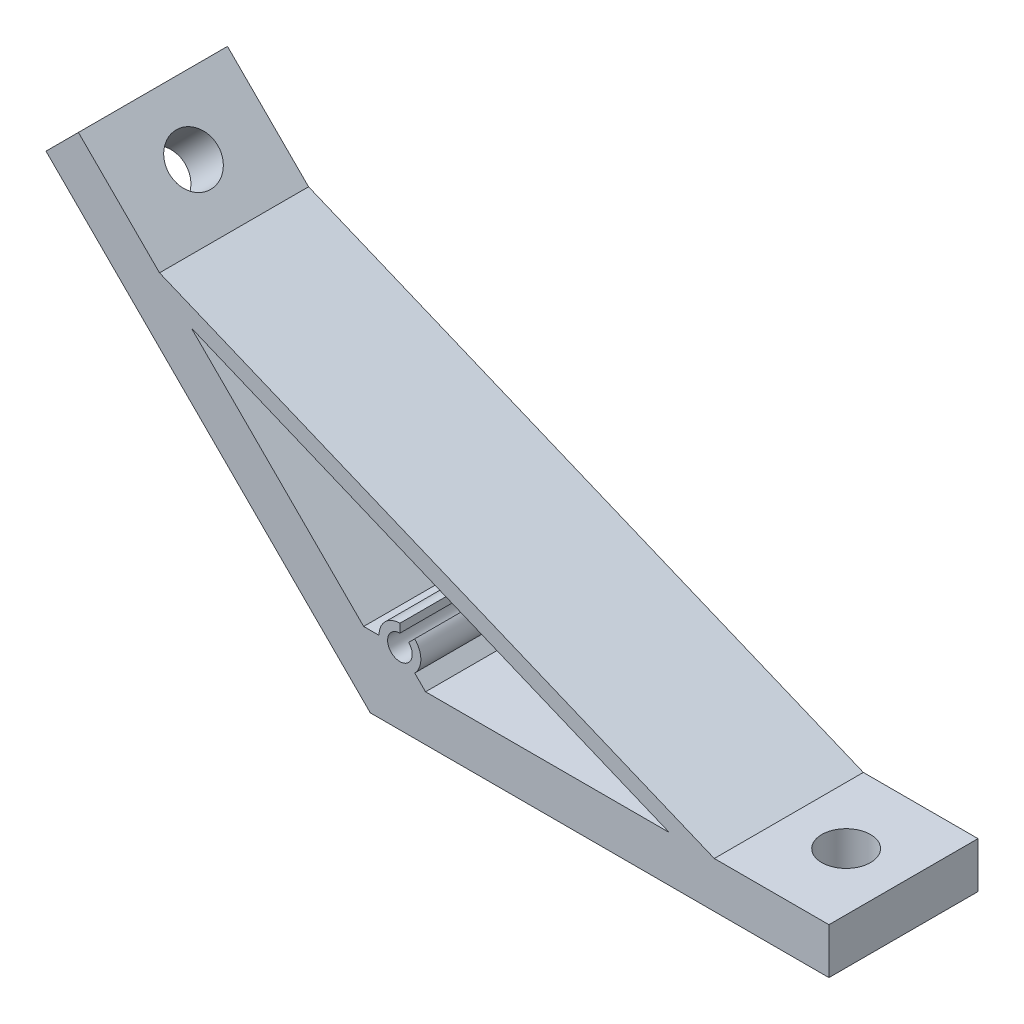
ISO-10303-21;
HEADER;
FILE_DESCRIPTION(('STEP AP214'),'2;1');
FILE_NAME('part.step','',(''),(''),'','','');
FILE_SCHEMA(('AUTOMOTIVE_DESIGN { 1 0 10303 214 1 1 1 1 }'));
ENDSEC;
DATA;
#1=APPLICATION_CONTEXT('core data for automotive mechanical design processes');
#2=APPLICATION_PROTOCOL_DEFINITION('international standard','automotive_design',2000,#1);
#3=PRODUCT_CONTEXT('',#1,'mechanical');
#4=PRODUCT('Part','Part','',(#3));
#5=PRODUCT_RELATED_PRODUCT_CATEGORY('part','',(#4));
#6=PRODUCT_DEFINITION_FORMATION('','',#4);
#7=PRODUCT_DEFINITION_CONTEXT('part definition',#1,'design');
#8=PRODUCT_DEFINITION('design','',#6,#7);
#9=PRODUCT_DEFINITION_SHAPE('','',#8);
#10=(LENGTH_UNIT() NAMED_UNIT(*) SI_UNIT(.MILLI.,.METRE.));
#11=(NAMED_UNIT(*) PLANE_ANGLE_UNIT() SI_UNIT($,.RADIAN.));
#12=(NAMED_UNIT(*) SI_UNIT($,.STERADIAN.) SOLID_ANGLE_UNIT());
#13=UNCERTAINTY_MEASURE_WITH_UNIT(LENGTH_MEASURE(1.E-05),#10,'distance_accuracy_value','');
#14=(GEOMETRIC_REPRESENTATION_CONTEXT(3) GLOBAL_UNCERTAINTY_ASSIGNED_CONTEXT((#13)) GLOBAL_UNIT_ASSIGNED_CONTEXT((#10,
#11,#12)) REPRESENTATION_CONTEXT('',''));
#15=CARTESIAN_POINT('',(0.,0.,0.));
#16=DIRECTION('',(0.,0.,1.));
#17=DIRECTION('',(1.,0.,0.));
#18=AXIS2_PLACEMENT_3D('',#15,#16,#17);
#19=CARTESIAN_POINT('',(-36.7695526216999,48.0832611206847,13.));
#20=DIRECTION('',(-0.707106781186536,-0.707106781186559,0.));
#21=DIRECTION('',(0.707106781186559,-0.707106781186536,0.));
#22=AXIS2_PLACEMENT_3D('',#19,#20,#21);
#23=PLANE('',#22);
#24=DIRECTION('',(-0.707106781186559,0.707106781186536,0.));
#25=VECTOR('',#24,1.);
#26=CARTESIAN_POINT('',(-36.7695526216999,48.0832611206847,-13.));
#27=LINE('',#26,#25);
#28=CARTESIAN_POINT('',(-36.7695526216999,48.0832611206847,-13.));
#29=VERTEX_POINT('',#28);
#30=CARTESIAN_POINT('',(-50.9116882454318,62.2253967444162,-13.));
#31=VERTEX_POINT('',#30);
#32=EDGE_CURVE('E260',#29,#31,#27,.T.);
#33=ORIENTED_EDGE('',*,*,#32,.T.);
#34=DIRECTION('',(0.,0.,-1.));
#35=VECTOR('',#34,1.);
#36=CARTESIAN_POINT('',(-50.9116882454318,62.2253967444162,13.));
#37=LINE('',#36,#35);
#38=CARTESIAN_POINT('',(-50.9116882454318,62.2253967444162,13.));
#39=VERTEX_POINT('',#38);
#40=EDGE_CURVE('E275',#39,#31,#37,.T.);
#41=ORIENTED_EDGE('',*,*,#40,.F.);
#42=DIRECTION('',(-0.707106781186559,0.707106781186536,0.));
#43=VECTOR('',#42,1.);
#44=CARTESIAN_POINT('',(-36.7695526216999,48.0832611206847,13.));
#45=LINE('',#44,#43);
#46=CARTESIAN_POINT('',(-36.7695526216999,48.0832611206847,13.));
#47=VERTEX_POINT('',#46);
#48=EDGE_CURVE('E245',#47,#39,#45,.T.);
#49=ORIENTED_EDGE('',*,*,#48,.F.);
#50=DIRECTION('',(0.,0.,-1.));
#51=VECTOR('',#50,1.);
#52=CARTESIAN_POINT('',(-36.7695526216999,48.0832611206847,13.));
#53=LINE('',#52,#51);
#54=EDGE_CURVE('E278',#47,#29,#53,.T.);
#55=ORIENTED_EDGE('',*,*,#54,.T.);
#56=EDGE_LOOP('',(#33,#41,#49,#55));
#57=FACE_BOUND('',#56,.T.);
#58=CARTESIAN_POINT('',(-43.840620433566,55.1543289325507,0.));
#59=DIRECTION('',(-0.707106781186552,-0.707106781186543,0.));
#60=DIRECTION('',(0.707106781186543,-0.707106781186552,0.));
#61=AXIS2_PLACEMENT_3D('',#58,#59,#60);
#62=CIRCLE('',#61,4.25000000000001);
#63=CARTESIAN_POINT('',(-40.8354166135232,52.1491251125078,0.));
#64=VERTEX_POINT('',#63);
#65=EDGE_CURVE('E325',#64,#64,#62,.T.);
#66=ORIENTED_EDGE('',*,*,#65,.T.);
#67=EDGE_LOOP('',(#66));
#68=FACE_BOUND('',#67,.T.);
#69=ADVANCED_FACE('F35',(#57,#68),#23,.F.);
#70=CARTESIAN_POINT('',(0.,0.,13.));
#71=DIRECTION('',(0.707106781186545,0.70710678118655,0.));
#72=DIRECTION('',(-0.70710678118655,0.707106781186545,0.));
#73=AXIS2_PLACEMENT_3D('',#70,#71,#72);
#74=PLANE('',#73);
#75=DIRECTION('',(0.70710678118655,-0.707106781186545,0.));
#76=VECTOR('',#75,1.);
#77=CARTESIAN_POINT('',(0.,0.,-13.));
#78=LINE('',#77,#76);
#79=CARTESIAN_POINT('',(-56.5685424949243,56.5685424949238,-13.));
#80=VERTEX_POINT('',#79);
#81=CARTESIAN_POINT('',(0.,0.,-13.));
#82=VERTEX_POINT('',#81);
#83=EDGE_CURVE('E264',#80,#82,#78,.T.);
#84=ORIENTED_EDGE('',*,*,#83,.T.);
#85=DIRECTION('',(0.,0.,-1.));
#86=VECTOR('',#85,1.);
#87=CARTESIAN_POINT('',(0.,0.,13.));
#88=LINE('',#87,#86);
#89=CARTESIAN_POINT('',(0.,0.,13.));
#90=VERTEX_POINT('',#89);
#91=EDGE_CURVE('E269',#90,#82,#88,.T.);
#92=ORIENTED_EDGE('',*,*,#91,.F.);
#93=DIRECTION('',(0.70710678118655,-0.707106781186545,0.));
#94=VECTOR('',#93,1.);
#95=CARTESIAN_POINT('',(0.,0.,13.));
#96=LINE('',#95,#94);
#97=CARTESIAN_POINT('',(-56.5685424949243,56.5685424949238,13.));
#98=VERTEX_POINT('',#97);
#99=EDGE_CURVE('E249',#98,#90,#96,.T.);
#100=ORIENTED_EDGE('',*,*,#99,.F.);
#101=DIRECTION('',(0.,0.,-1.));
#102=VECTOR('',#101,1.);
#103=CARTESIAN_POINT('',(-56.5685424949243,56.5685424949238,13.));
#104=LINE('',#103,#102);
#105=EDGE_CURVE('E272',#98,#80,#104,.T.);
#106=ORIENTED_EDGE('',*,*,#105,.T.);
#107=EDGE_LOOP('',(#84,#92,#100,#106));
#108=FACE_BOUND('',#107,.T.);
#109=CARTESIAN_POINT('',(-49.4974746830586,49.4974746830582,0.));
#110=DIRECTION('',(0.707106781186545,0.70710678118655,0.));
#111=DIRECTION('',(-0.70710678118655,0.707106781186545,0.));
#112=AXIS2_PLACEMENT_3D('',#109,#110,#111);
#113=CIRCLE('',#112,4.25000000000001);
#114=CARTESIAN_POINT('',(-52.5026785031014,52.502678503101,0.));
#115=VERTEX_POINT('',#114);
#116=EDGE_CURVE('E39',#115,#115,#113,.F.);
#117=ORIENTED_EDGE('',*,*,#116,.F.);
#118=EDGE_LOOP('',(#117));
#119=FACE_BOUND('',#118,.T.);
#120=ADVANCED_FACE('F317',(#108,#119),#74,.F.);
#121=CARTESIAN_POINT('',(0.,0.,13.));
#122=DIRECTION('',(0.,0.,-1.));
#123=DIRECTION('',(-1.,0.,0.));
#124=AXIS2_PLACEMENT_3D('',#121,#122,#123);
#125=PLANE('',#124);
#126=DIRECTION('',(0.,1.,0.));
#127=VECTOR('',#126,1.);
#128=CARTESIAN_POINT('',(80.,8.,13.));
#129=LINE('',#128,#127);
#130=CARTESIAN_POINT('',(80.,0.,13.));
#131=VERTEX_POINT('',#130);
#132=CARTESIAN_POINT('',(80.,8.,13.));
#133=VERTEX_POINT('',#132);
#134=EDGE_CURVE('E237',#131,#133,#129,.T.);
#135=ORIENTED_EDGE('',*,*,#134,.T.);
#136=DIRECTION('',(-1.,0.,0.));
#137=VECTOR('',#136,1.);
#138=CARTESIAN_POINT('',(80.,8.,13.));
#139=LINE('',#138,#137);
#140=CARTESIAN_POINT('',(59.9999999999991,7.99999999999989,13.));
#141=VERTEX_POINT('',#140);
#142=EDGE_CURVE('E240',#133,#141,#139,.T.);
#143=ORIENTED_EDGE('',*,*,#142,.T.);
#144=DIRECTION('',(-0.923879532511286,0.382683432365092,0.));
#145=VECTOR('',#144,1.);
#146=CARTESIAN_POINT('',(-36.7695526216999,48.0832611206847,13.));
#147=LINE('',#146,#145);
#148=EDGE_CURVE('E243',#141,#47,#147,.T.);
#149=ORIENTED_EDGE('',*,*,#148,.T.);
#150=ORIENTED_EDGE('',*,*,#48,.T.);
#151=DIRECTION('',(-0.707106781186548,-0.707106781186548,0.));
#152=VECTOR('',#151,1.);
#153=CARTESIAN_POINT('',(-50.9116882454318,62.2253967444162,13.));
#154=LINE('',#153,#152);
#155=EDGE_CURVE('E247',#39,#98,#154,.T.);
#156=ORIENTED_EDGE('',*,*,#155,.T.);
#157=ORIENTED_EDGE('',*,*,#99,.T.);
#158=DIRECTION('',(1.,0.,0.));
#159=VECTOR('',#158,1.);
#160=CARTESIAN_POINT('',(80.,0.,13.));
#161=LINE('',#160,#159);
#162=EDGE_CURVE('E251',#90,#131,#161,.T.);
#163=ORIENTED_EDGE('',*,*,#162,.T.);
#164=EDGE_LOOP('',(#135,#143,#149,#150,#156,#157,#163));
#165=FACE_BOUND('',#164,.T.);
#166=DIRECTION('',(-0.92387953251129,0.382683432365082,0.));
#167=VECTOR('',#166,1.);
#168=CARTESIAN_POINT('',(-31.2262754266308,42.5399839256161,13.));
#169=LINE('',#168,#167);
#170=CARTESIAN_POINT('',(52.1606222107425,7.99999999999989,13.));
#171=VERTEX_POINT('',#170);
#172=CARTESIAN_POINT('',(-31.2262754266308,42.5399839256161,13.));
#173=VERTEX_POINT('',#172);
#174=EDGE_CURVE('E155',#171,#173,#169,.T.);
#175=ORIENTED_EDGE('',*,*,#174,.F.);
#176=DIRECTION('',(1.,0.,0.));
#177=VECTOR('',#176,1.);
#178=CARTESIAN_POINT('',(52.1606222107425,7.99999999999989,13.));
#179=LINE('',#178,#177);
#180=CARTESIAN_POINT('',(9.63860002583124,8.,13.));
#181=VERTEX_POINT('',#180);
#182=EDGE_CURVE('E194',#181,#171,#179,.T.);
#183=ORIENTED_EDGE('',*,*,#182,.F.);
#184=DIRECTION('',(0.70710678118647,-0.707106781186625,0.));
#185=VECTOR('',#184,1.);
#186=CARTESIAN_POINT('',(9.63860002583124,8.,13.));
#187=LINE('',#186,#185);
#188=CARTESIAN_POINT('',(7.74716608826006,9.89143393757159,13.));
#189=VERTEX_POINT('',#188);
#190=EDGE_CURVE('E192',#189,#181,#187,.T.);
#191=ORIENTED_EDGE('',*,*,#190,.F.);
#192=CARTESIAN_POINT('',(5.16622633692896,12.4723736889023,13.));
#193=DIRECTION('',(0.,0.,-1.));
#194=DIRECTION('',(1.,0.,0.));
#195=AXIS2_PLACEMENT_3D('',#192,#193,#194);
#196=CIRCLE('',#195,3.65);
#197=CARTESIAN_POINT('',(7.74716608826007,15.053313440233,13.));
#198=VERTEX_POINT('',#197);
#199=EDGE_CURVE('E190',#198,#189,#196,.T.);
#200=ORIENTED_EDGE('',*,*,#199,.F.);
#201=DIRECTION('',(0.707106781186523,0.707106781186572,0.));
#202=VECTOR('',#201,1.);
#203=CARTESIAN_POINT('',(6.68650591648028,13.9926532684531,13.));
#204=LINE('',#203,#202);
#205=CARTESIAN_POINT('',(6.68650591648028,13.9926532684531,13.));
#206=VERTEX_POINT('',#205);
#207=EDGE_CURVE('E188',#206,#198,#204,.T.);
#208=ORIENTED_EDGE('',*,*,#207,.F.);
#209=CARTESIAN_POINT('',(5.16622633692896,12.4723736889023,13.));
#210=DIRECTION('',(0.,0.,1.));
#211=DIRECTION('',(1.,0.,0.));
#212=AXIS2_PLACEMENT_3D('',#209,#210,#211);
#213=CIRCLE('',#212,2.15);
#214=CARTESIAN_POINT('',(5.16622633692896,14.6223736889023,13.));
#215=VERTEX_POINT('',#214);
#216=EDGE_CURVE('E186',#215,#206,#213,.T.);
#217=ORIENTED_EDGE('',*,*,#216,.F.);
#218=DIRECTION('',(0.,-1.,0.));
#219=VECTOR('',#218,1.);
#220=CARTESIAN_POINT('',(5.16622633692896,14.6223736889023,13.));
#221=LINE('',#220,#219);
#222=CARTESIAN_POINT('',(5.16622633692896,16.1223736889023,13.));
#223=VERTEX_POINT('',#222);
#224=EDGE_CURVE('E184',#223,#215,#221,.T.);
#225=ORIENTED_EDGE('',*,*,#224,.F.);
#226=CARTESIAN_POINT('',(5.16622633692896,12.4723736889023,13.));
#227=DIRECTION('',(0.,0.,-1.));
#228=DIRECTION('',(1.,0.,0.));
#229=AXIS2_PLACEMENT_3D('',#226,#227,#228);
#230=CIRCLE('',#229,3.65);
#231=CARTESIAN_POINT('',(1.51622633692896,12.4723736889023,13.));
#232=VERTEX_POINT('',#231);
#233=EDGE_CURVE('E179',#232,#223,#230,.T.);
#234=ORIENTED_EDGE('',*,*,#233,.F.);
#235=DIRECTION('',(1.,0.,0.));
#236=VECTOR('',#235,1.);
#237=CARTESIAN_POINT('',(-1.15866518991743,12.4723736889023,13.));
#238=LINE('',#237,#236);
#239=CARTESIAN_POINT('',(-1.15866518991743,12.4723736889023,13.));
#240=VERTEX_POINT('',#239);
#241=EDGE_CURVE('E177',#240,#232,#238,.T.);
#242=ORIENTED_EDGE('',*,*,#241,.F.);
#243=DIRECTION('',(0.707106781186542,-0.707106781186553,0.));
#244=VECTOR('',#243,1.);
#245=CARTESIAN_POINT('',(-1.15866518991743,12.4723736889023,13.));
#246=LINE('',#245,#244);
#247=EDGE_CURVE('E163',#173,#240,#246,.T.);
#248=ORIENTED_EDGE('',*,*,#247,.F.);
#249=EDGE_LOOP('',(#175,#183,#191,#200,#208,#217,#225,#234,#242,#248));
#250=FACE_BOUND('',#249,.T.);
#251=ADVANCED_FACE('F175',(#165,#250),#125,.F.);
#252=CARTESIAN_POINT('',(0.,0.,-13.));
#253=DIRECTION('',(0.,0.,-1.));
#254=DIRECTION('',(-1.,0.,0.));
#255=AXIS2_PLACEMENT_3D('',#252,#253,#254);
#256=PLANE('',#255);
#257=DIRECTION('',(0.,1.,0.));
#258=VECTOR('',#257,1.);
#259=CARTESIAN_POINT('',(80.,8.,-13.));
#260=LINE('',#259,#258);
#261=CARTESIAN_POINT('',(80.,0.,-13.));
#262=VERTEX_POINT('',#261);
#263=CARTESIAN_POINT('',(80.,8.,-13.));
#264=VERTEX_POINT('',#263);
#265=EDGE_CURVE('E171',#262,#264,#260,.T.);
#266=ORIENTED_EDGE('',*,*,#265,.F.);
#267=DIRECTION('',(1.,0.,0.));
#268=VECTOR('',#267,1.);
#269=CARTESIAN_POINT('',(80.,0.,-13.));
#270=LINE('',#269,#268);
#271=EDGE_CURVE('E241',#82,#262,#270,.T.);
#272=ORIENTED_EDGE('',*,*,#271,.F.);
#273=ORIENTED_EDGE('',*,*,#83,.F.);
#274=DIRECTION('',(-0.707106781186548,-0.707106781186548,0.));
#275=VECTOR('',#274,1.);
#276=CARTESIAN_POINT('',(-50.9116882454318,62.2253967444162,-13.));
#277=LINE('',#276,#275);
#278=EDGE_CURVE('E262',#31,#80,#277,.T.);
#279=ORIENTED_EDGE('',*,*,#278,.F.);
#280=ORIENTED_EDGE('',*,*,#32,.F.);
#281=DIRECTION('',(-0.923879532511286,0.382683432365092,0.));
#282=VECTOR('',#281,1.);
#283=CARTESIAN_POINT('',(-36.7695526216999,48.0832611206847,-13.));
#284=LINE('',#283,#282);
#285=CARTESIAN_POINT('',(59.9999999999991,7.99999999999989,-13.));
#286=VERTEX_POINT('',#285);
#287=EDGE_CURVE('E258',#286,#29,#284,.T.);
#288=ORIENTED_EDGE('',*,*,#287,.F.);
#289=DIRECTION('',(-1.,0.,0.));
#290=VECTOR('',#289,1.);
#291=CARTESIAN_POINT('',(80.,8.,-13.));
#292=LINE('',#291,#290);
#293=EDGE_CURVE('E256',#264,#286,#292,.T.);
#294=ORIENTED_EDGE('',*,*,#293,.F.);
#295=EDGE_LOOP('',(#266,#272,#273,#279,#280,#288,#294));
#296=FACE_BOUND('',#295,.T.);
#297=DIRECTION('',(1.,0.,0.));
#298=VECTOR('',#297,1.);
#299=CARTESIAN_POINT('',(52.1606222107425,7.99999999999989,-13.));
#300=LINE('',#299,#298);
#301=CARTESIAN_POINT('',(9.63860002583124,8.,-13.));
#302=VERTEX_POINT('',#301);
#303=CARTESIAN_POINT('',(52.1606222107425,7.99999999999989,-13.));
#304=VERTEX_POINT('',#303);
#305=EDGE_CURVE('E164',#302,#304,#300,.T.);
#306=ORIENTED_EDGE('',*,*,#305,.T.);
#307=DIRECTION('',(-0.92387953251129,0.382683432365082,0.));
#308=VECTOR('',#307,1.);
#309=CARTESIAN_POINT('',(-31.2262754266308,42.5399839256161,-13.));
#310=LINE('',#309,#308);
#311=CARTESIAN_POINT('',(-31.2262754266308,42.5399839256161,-13.));
#312=VERTEX_POINT('',#311);
#313=EDGE_CURVE('E59',#304,#312,#310,.T.);
#314=ORIENTED_EDGE('',*,*,#313,.T.);
#315=DIRECTION('',(0.707106781186542,-0.707106781186553,0.));
#316=VECTOR('',#315,1.);
#317=CARTESIAN_POINT('',(-1.15866518991743,12.4723736889023,-13.));
#318=LINE('',#317,#316);
#319=CARTESIAN_POINT('',(-1.15866518991743,12.4723736889023,-13.));
#320=VERTEX_POINT('',#319);
#321=EDGE_CURVE('E170',#312,#320,#318,.T.);
#322=ORIENTED_EDGE('',*,*,#321,.T.);
#323=DIRECTION('',(1.,0.,0.));
#324=VECTOR('',#323,1.);
#325=CARTESIAN_POINT('',(-1.15866518991743,12.4723736889023,-13.));
#326=LINE('',#325,#324);
#327=CARTESIAN_POINT('',(1.51622633692896,12.4723736889023,-13.));
#328=VERTEX_POINT('',#327);
#329=EDGE_CURVE('E199',#320,#328,#326,.T.);
#330=ORIENTED_EDGE('',*,*,#329,.T.);
#331=CARTESIAN_POINT('',(5.16622633692896,12.4723736889023,-13.));
#332=DIRECTION('',(0.,0.,-1.));
#333=DIRECTION('',(1.,0.,0.));
#334=AXIS2_PLACEMENT_3D('',#331,#332,#333);
#335=CIRCLE('',#334,3.65);
#336=CARTESIAN_POINT('',(5.16622633692896,16.1223736889023,-13.));
#337=VERTEX_POINT('',#336);
#338=EDGE_CURVE('E202',#328,#337,#335,.T.);
#339=ORIENTED_EDGE('',*,*,#338,.T.);
#340=DIRECTION('',(0.,-1.,0.));
#341=VECTOR('',#340,1.);
#342=CARTESIAN_POINT('',(5.16622633692896,14.6223736889023,-13.));
#343=LINE('',#342,#341);
#344=CARTESIAN_POINT('',(5.16622633692896,14.6223736889023,-13.));
#345=VERTEX_POINT('',#344);
#346=EDGE_CURVE('E205',#337,#345,#343,.T.);
#347=ORIENTED_EDGE('',*,*,#346,.T.);
#348=CARTESIAN_POINT('',(5.16622633692896,12.4723736889023,-13.));
#349=DIRECTION('',(0.,0.,1.));
#350=DIRECTION('',(1.,0.,0.));
#351=AXIS2_PLACEMENT_3D('',#348,#349,#350);
#352=CIRCLE('',#351,2.15);
#353=CARTESIAN_POINT('',(6.68650591648028,13.9926532684531,-13.));
#354=VERTEX_POINT('',#353);
#355=EDGE_CURVE('E208',#345,#354,#352,.T.);
#356=ORIENTED_EDGE('',*,*,#355,.T.);
#357=DIRECTION('',(0.707106781186523,0.707106781186572,0.));
#358=VECTOR('',#357,1.);
#359=CARTESIAN_POINT('',(6.68650591648028,13.9926532684531,-13.));
#360=LINE('',#359,#358);
#361=CARTESIAN_POINT('',(7.74716608826007,15.053313440233,-13.));
#362=VERTEX_POINT('',#361);
#363=EDGE_CURVE('E211',#354,#362,#360,.T.);
#364=ORIENTED_EDGE('',*,*,#363,.T.);
#365=CARTESIAN_POINT('',(5.16622633692896,12.4723736889023,-13.));
#366=DIRECTION('',(0.,0.,-1.));
#367=DIRECTION('',(1.,0.,0.));
#368=AXIS2_PLACEMENT_3D('',#365,#366,#367);
#369=CIRCLE('',#368,3.65);
#370=CARTESIAN_POINT('',(7.74716608826006,9.89143393757159,-13.));
#371=VERTEX_POINT('',#370);
#372=EDGE_CURVE('E214',#362,#371,#369,.T.);
#373=ORIENTED_EDGE('',*,*,#372,.T.);
#374=DIRECTION('',(0.70710678118647,-0.707106781186625,0.));
#375=VECTOR('',#374,1.);
#376=CARTESIAN_POINT('',(9.63860002583124,8.,-13.));
#377=LINE('',#376,#375);
#378=EDGE_CURVE('E217',#371,#302,#377,.T.);
#379=ORIENTED_EDGE('',*,*,#378,.T.);
#380=EDGE_LOOP('',(#306,#314,#322,#330,#339,#347,#356,#364,#373,#379));
#381=FACE_BOUND('',#380,.T.);
#382=ADVANCED_FACE('F292',(#296,#381),#256,.T.);
#383=CARTESIAN_POINT('',(80.,8.,13.));
#384=DIRECTION('',(-1.,0.,0.));
#385=DIRECTION('',(0.,0.,1.));
#386=AXIS2_PLACEMENT_3D('',#383,#384,#385);
#387=PLANE('',#386);
#388=ORIENTED_EDGE('',*,*,#265,.T.);
#389=DIRECTION('',(0.,0.,-1.));
#390=VECTOR('',#389,1.);
#391=CARTESIAN_POINT('',(80.,8.,13.));
#392=LINE('',#391,#390);
#393=EDGE_CURVE('E11',#133,#264,#392,.T.);
#394=ORIENTED_EDGE('',*,*,#393,.F.);
#395=ORIENTED_EDGE('',*,*,#134,.F.);
#396=DIRECTION('',(0.,0.,-1.));
#397=VECTOR('',#396,1.);
#398=CARTESIAN_POINT('',(80.,0.,13.));
#399=LINE('',#398,#397);
#400=EDGE_CURVE('E253',#131,#262,#399,.T.);
#401=ORIENTED_EDGE('',*,*,#400,.T.);
#402=EDGE_LOOP('',(#388,#394,#395,#401));
#403=FACE_BOUND('',#402,.T.);
#404=ADVANCED_FACE('F37',(#403),#387,.F.);
#405=CARTESIAN_POINT('',(80.,8.,13.));
#406=DIRECTION('',(0.,-1.,0.));
#407=DIRECTION('',(1.,0.,0.));
#408=AXIS2_PLACEMENT_3D('',#405,#406,#407);
#409=PLANE('',#408);
#410=CARTESIAN_POINT('',(70.,7.99999999999994,0.));
#411=DIRECTION('',(0.,1.,0.));
#412=DIRECTION('',(-1.,0.,0.));
#413=AXIS2_PLACEMENT_3D('',#410,#411,#412);
#414=CIRCLE('',#413,4.25000000000001);
#415=CARTESIAN_POINT('',(65.75,7.99999999999992,0.));
#416=VERTEX_POINT('',#415);
#417=EDGE_CURVE('E324',#416,#416,#414,.T.);
#418=ORIENTED_EDGE('',*,*,#417,.F.);
#419=EDGE_LOOP('',(#418));
#420=FACE_BOUND('',#419,.T.);
#421=ORIENTED_EDGE('',*,*,#293,.T.);
#422=DIRECTION('',(0.,0.,-1.));
#423=VECTOR('',#422,1.);
#424=CARTESIAN_POINT('',(59.9999999999991,7.99999999999989,13.));
#425=LINE('',#424,#423);
#426=EDGE_CURVE('E44',#141,#286,#425,.T.);
#427=ORIENTED_EDGE('',*,*,#426,.F.);
#428=ORIENTED_EDGE('',*,*,#142,.F.);
#429=ORIENTED_EDGE('',*,*,#393,.T.);
#430=EDGE_LOOP('',(#421,#427,#428,#429));
#431=FACE_BOUND('',#430,.T.);
#432=ADVANCED_FACE('F309',(#420,#431),#409,.F.);
#433=CARTESIAN_POINT('',(-36.7695526216999,48.0832611206847,13.));
#434=DIRECTION('',(-0.382683432365092,-0.923879532511286,0.));
#435=DIRECTION('',(0.923879532511286,-0.382683432365092,0.));
#436=AXIS2_PLACEMENT_3D('',#433,#434,#435);
#437=PLANE('',#436);
#438=ORIENTED_EDGE('',*,*,#287,.T.);
#439=ORIENTED_EDGE('',*,*,#54,.F.);
#440=ORIENTED_EDGE('',*,*,#148,.F.);
#441=ORIENTED_EDGE('',*,*,#426,.T.);
#442=EDGE_LOOP('',(#438,#439,#440,#441));
#443=FACE_BOUND('',#442,.T.);
#444=ADVANCED_FACE('F286',(#443),#437,.F.);
#445=CARTESIAN_POINT('',(-50.9116882454318,62.2253967444162,13.));
#446=DIRECTION('',(0.707106781186548,-0.707106781186548,0.));
#447=DIRECTION('',(0.707106781186548,0.707106781186548,0.));
#448=AXIS2_PLACEMENT_3D('',#445,#446,#447);
#449=PLANE('',#448);
#450=ORIENTED_EDGE('',*,*,#278,.T.);
#451=ORIENTED_EDGE('',*,*,#105,.F.);
#452=ORIENTED_EDGE('',*,*,#155,.F.);
#453=ORIENTED_EDGE('',*,*,#40,.T.);
#454=EDGE_LOOP('',(#450,#451,#452,#453));
#455=FACE_BOUND('',#454,.T.);
#456=ADVANCED_FACE('F302',(#455),#449,.F.);
#457=CARTESIAN_POINT('',(80.,0.,13.));
#458=DIRECTION('',(0.,1.,0.));
#459=DIRECTION('',(0.,0.,1.));
#460=AXIS2_PLACEMENT_3D('',#457,#458,#459);
#461=PLANE('',#460);
#462=CARTESIAN_POINT('',(70.,0.,0.));
#463=DIRECTION('',(0.,1.,0.));
#464=DIRECTION('',(-1.,0.,0.));
#465=AXIS2_PLACEMENT_3D('',#462,#463,#464);
#466=CIRCLE('',#465,4.25000000000001);
#467=CARTESIAN_POINT('',(65.75,0.,0.));
#468=VERTEX_POINT('',#467);
#469=EDGE_CURVE('E197',#468,#468,#466,.T.);
#470=ORIENTED_EDGE('',*,*,#469,.T.);
#471=EDGE_LOOP('',(#470));
#472=FACE_BOUND('',#471,.T.);
#473=ORIENTED_EDGE('',*,*,#271,.T.);
#474=ORIENTED_EDGE('',*,*,#400,.F.);
#475=ORIENTED_EDGE('',*,*,#162,.F.);
#476=ORIENTED_EDGE('',*,*,#91,.T.);
#477=EDGE_LOOP('',(#473,#474,#475,#476));
#478=FACE_BOUND('',#477,.T.);
#479=ADVANCED_FACE('F314',(#472,#478),#461,.F.);
#480=CARTESIAN_POINT('',(-31.2262754266308,42.5399839256161,13.));
#481=DIRECTION('',(-0.382683432365082,-0.92387953251129,0.));
#482=DIRECTION('',(0.92387953251129,-0.382683432365082,0.));
#483=AXIS2_PLACEMENT_3D('',#480,#481,#482);
#484=PLANE('',#483);
#485=ORIENTED_EDGE('',*,*,#313,.F.);
#486=DIRECTION('',(0.,0.,-1.));
#487=VECTOR('',#486,1.);
#488=CARTESIAN_POINT('',(52.1606222107425,7.99999999999989,13.));
#489=LINE('',#488,#487);
#490=EDGE_CURVE('E159',#171,#304,#489,.T.);
#491=ORIENTED_EDGE('',*,*,#490,.F.);
#492=ORIENTED_EDGE('',*,*,#174,.T.);
#493=DIRECTION('',(0.,0.,-1.));
#494=VECTOR('',#493,1.);
#495=CARTESIAN_POINT('',(-31.2262754266308,42.5399839256161,13.));
#496=LINE('',#495,#494);
#497=EDGE_CURVE('E158',#173,#312,#496,.T.);
#498=ORIENTED_EDGE('',*,*,#497,.T.);
#499=EDGE_LOOP('',(#485,#491,#492,#498));
#500=FACE_BOUND('',#499,.T.);
#501=ADVANCED_FACE('F157',(#500),#484,.T.);
#502=CARTESIAN_POINT('',(-1.15866518991743,12.4723736889023,13.));
#503=DIRECTION('',(0.707106781186553,0.707106781186542,0.));
#504=DIRECTION('',(-0.707106781186542,0.707106781186553,0.));
#505=AXIS2_PLACEMENT_3D('',#502,#503,#504);
#506=PLANE('',#505);
#507=ORIENTED_EDGE('',*,*,#321,.F.);
#508=ORIENTED_EDGE('',*,*,#497,.F.);
#509=ORIENTED_EDGE('',*,*,#247,.T.);
#510=DIRECTION('',(0.,0.,-1.));
#511=VECTOR('',#510,1.);
#512=CARTESIAN_POINT('',(-1.15866518991743,12.4723736889023,13.));
#513=LINE('',#512,#511);
#514=EDGE_CURVE('E172',#240,#320,#513,.T.);
#515=ORIENTED_EDGE('',*,*,#514,.T.);
#516=EDGE_LOOP('',(#507,#508,#509,#515));
#517=FACE_BOUND('',#516,.T.);
#518=ADVANCED_FACE('F167',(#517),#506,.T.);
#519=CARTESIAN_POINT('',(-1.15866518991743,12.4723736889023,13.));
#520=DIRECTION('',(0.,1.,0.));
#521=DIRECTION('',(0.,0.,1.));
#522=AXIS2_PLACEMENT_3D('',#519,#520,#521);
#523=PLANE('',#522);
#524=ORIENTED_EDGE('',*,*,#329,.F.);
#525=ORIENTED_EDGE('',*,*,#514,.F.);
#526=ORIENTED_EDGE('',*,*,#241,.T.);
#527=DIRECTION('',(0.,0.,-1.));
#528=VECTOR('',#527,1.);
#529=CARTESIAN_POINT('',(1.51622633692896,12.4723736889023,13.));
#530=LINE('',#529,#528);
#531=EDGE_CURVE('E234',#232,#328,#530,.T.);
#532=ORIENTED_EDGE('',*,*,#531,.T.);
#533=EDGE_LOOP('',(#524,#525,#526,#532));
#534=FACE_BOUND('',#533,.T.);
#535=ADVANCED_FACE('F366',(#534),#523,.T.);
#536=CARTESIAN_POINT('',(5.16622633692896,12.4723736889023,13.));
#537=DIRECTION('',(0.,0.,-1.));
#538=DIRECTION('',(-1.,0.,0.));
#539=AXIS2_PLACEMENT_3D('',#536,#537,#538);
#540=CYLINDRICAL_SURFACE('',#539,3.65);
#541=ORIENTED_EDGE('',*,*,#338,.F.);
#542=ORIENTED_EDGE('',*,*,#531,.F.);
#543=ORIENTED_EDGE('',*,*,#233,.T.);
#544=DIRECTION('',(0.,0.,-1.));
#545=VECTOR('',#544,1.);
#546=CARTESIAN_POINT('',(5.16622633692896,16.1223736889023,13.));
#547=LINE('',#546,#545);
#548=EDGE_CURVE('E232',#223,#337,#547,.T.);
#549=ORIENTED_EDGE('',*,*,#548,.T.);
#550=EDGE_LOOP('',(#541,#542,#543,#549));
#551=FACE_BOUND('',#550,.T.);
#552=ADVANCED_FACE('F369',(#551),#540,.T.);
#553=CARTESIAN_POINT('',(5.16622633692896,14.6223736889023,13.));
#554=DIRECTION('',(1.,0.,0.));
#555=DIRECTION('',(0.,0.,-1.));
#556=AXIS2_PLACEMENT_3D('',#553,#554,#555);
#557=PLANE('',#556);
#558=ORIENTED_EDGE('',*,*,#346,.F.);
#559=ORIENTED_EDGE('',*,*,#548,.F.);
#560=ORIENTED_EDGE('',*,*,#224,.T.);
#561=DIRECTION('',(0.,0.,-1.));
#562=VECTOR('',#561,1.);
#563=CARTESIAN_POINT('',(5.16622633692896,14.6223736889023,13.));
#564=LINE('',#563,#562);
#565=EDGE_CURVE('E230',#215,#345,#564,.T.);
#566=ORIENTED_EDGE('',*,*,#565,.T.);
#567=EDGE_LOOP('',(#558,#559,#560,#566));
#568=FACE_BOUND('',#567,.T.);
#569=ADVANCED_FACE('F373',(#568),#557,.T.);
#570=CARTESIAN_POINT('',(5.16622633692896,12.4723736889023,13.));
#571=DIRECTION('',(0.,0.,-1.));
#572=DIRECTION('',(-1.,0.,0.));
#573=AXIS2_PLACEMENT_3D('',#570,#571,#572);
#574=CYLINDRICAL_SURFACE('',#573,2.15);
#575=ORIENTED_EDGE('',*,*,#355,.F.);
#576=ORIENTED_EDGE('',*,*,#565,.F.);
#577=ORIENTED_EDGE('',*,*,#216,.T.);
#578=DIRECTION('',(0.,0.,-1.));
#579=VECTOR('',#578,1.);
#580=CARTESIAN_POINT('',(6.68650591648028,13.9926532684531,13.));
#581=LINE('',#580,#579);
#582=EDGE_CURVE('E228',#206,#354,#581,.T.);
#583=ORIENTED_EDGE('',*,*,#582,.T.);
#584=EDGE_LOOP('',(#575,#576,#577,#583));
#585=FACE_BOUND('',#584,.T.);
#586=ADVANCED_FACE('F377',(#585),#574,.F.);
#587=CARTESIAN_POINT('',(6.68650591648028,13.9926532684531,13.));
#588=DIRECTION('',(-0.707106781186572,0.707106781186523,0.));
#589=DIRECTION('',(-0.707106781186523,-0.707106781186572,0.));
#590=AXIS2_PLACEMENT_3D('',#587,#588,#589);
#591=PLANE('',#590);
#592=ORIENTED_EDGE('',*,*,#363,.F.);
#593=ORIENTED_EDGE('',*,*,#582,.F.);
#594=ORIENTED_EDGE('',*,*,#207,.T.);
#595=DIRECTION('',(0.,0.,-1.));
#596=VECTOR('',#595,1.);
#597=CARTESIAN_POINT('',(7.74716608826007,15.053313440233,13.));
#598=LINE('',#597,#596);
#599=EDGE_CURVE('E226',#198,#362,#598,.T.);
#600=ORIENTED_EDGE('',*,*,#599,.T.);
#601=EDGE_LOOP('',(#592,#593,#594,#600));
#602=FACE_BOUND('',#601,.T.);
#603=ADVANCED_FACE('F381',(#602),#591,.T.);
#604=CARTESIAN_POINT('',(5.16622633692896,12.4723736889023,13.));
#605=DIRECTION('',(0.,0.,-1.));
#606=DIRECTION('',(-1.,0.,0.));
#607=AXIS2_PLACEMENT_3D('',#604,#605,#606);
#608=CYLINDRICAL_SURFACE('',#607,3.65);
#609=ORIENTED_EDGE('',*,*,#372,.F.);
#610=ORIENTED_EDGE('',*,*,#599,.F.);
#611=ORIENTED_EDGE('',*,*,#199,.T.);
#612=DIRECTION('',(0.,0.,-1.));
#613=VECTOR('',#612,1.);
#614=CARTESIAN_POINT('',(7.74716608826006,9.89143393757159,13.));
#615=LINE('',#614,#613);
#616=EDGE_CURVE('E224',#189,#371,#615,.T.);
#617=ORIENTED_EDGE('',*,*,#616,.T.);
#618=EDGE_LOOP('',(#609,#610,#611,#617));
#619=FACE_BOUND('',#618,.T.);
#620=ADVANCED_FACE('F385',(#619),#608,.T.);
#621=CARTESIAN_POINT('',(9.63860002583124,8.,13.));
#622=DIRECTION('',(0.707106781186625,0.70710678118647,0.));
#623=DIRECTION('',(-0.70710678118647,0.707106781186625,0.));
#624=AXIS2_PLACEMENT_3D('',#621,#622,#623);
#625=PLANE('',#624);
#626=ORIENTED_EDGE('',*,*,#378,.F.);
#627=ORIENTED_EDGE('',*,*,#616,.F.);
#628=ORIENTED_EDGE('',*,*,#190,.T.);
#629=DIRECTION('',(0.,0.,-1.));
#630=VECTOR('',#629,1.);
#631=CARTESIAN_POINT('',(9.63860002583124,8.,13.));
#632=LINE('',#631,#630);
#633=EDGE_CURVE('E51',#181,#302,#632,.T.);
#634=ORIENTED_EDGE('',*,*,#633,.T.);
#635=EDGE_LOOP('',(#626,#627,#628,#634));
#636=FACE_BOUND('',#635,.T.);
#637=ADVANCED_FACE('F389',(#636),#625,.T.);
#638=CARTESIAN_POINT('',(52.1606222107425,7.99999999999989,13.));
#639=DIRECTION('',(0.,1.,0.));
#640=DIRECTION('',(-1.,0.,0.));
#641=AXIS2_PLACEMENT_3D('',#638,#639,#640);
#642=PLANE('',#641);
#643=ORIENTED_EDGE('',*,*,#305,.F.);
#644=ORIENTED_EDGE('',*,*,#633,.F.);
#645=ORIENTED_EDGE('',*,*,#182,.T.);
#646=ORIENTED_EDGE('',*,*,#490,.T.);
#647=EDGE_LOOP('',(#643,#644,#645,#646));
#648=FACE_BOUND('',#647,.T.);
#649=ADVANCED_FACE('F339',(#648),#642,.T.);
#650=CARTESIAN_POINT('',(70.,0.,0.));
#651=DIRECTION('',(0.,1.,0.));
#652=DIRECTION('',(-1.,0.,0.));
#653=AXIS2_PLACEMENT_3D('',#650,#651,#652);
#654=CYLINDRICAL_SURFACE('',#653,4.25000000000001);
#655=ORIENTED_EDGE('',*,*,#469,.F.);
#656=EDGE_LOOP('',(#655));
#657=FACE_BOUND('',#656,.T.);
#658=ORIENTED_EDGE('',*,*,#417,.T.);
#659=EDGE_LOOP('',(#658));
#660=FACE_BOUND('',#659,.T.);
#661=ADVANCED_FACE('F335',(#657,#660),#654,.F.);
#662=CARTESIAN_POINT('',(-77.7817459305206,21.2132034355965,0.));
#663=DIRECTION('',(0.707106781186552,0.707106781186544,0.));
#664=DIRECTION('',(-0.707106781186544,0.707106781186552,0.));
#665=AXIS2_PLACEMENT_3D('',#662,#663,#664);
#666=CYLINDRICAL_SURFACE('',#665,4.25000000000001);
#667=ORIENTED_EDGE('',*,*,#65,.F.);
#668=EDGE_LOOP('',(#667));
#669=FACE_BOUND('',#668,.T.);
#670=ORIENTED_EDGE('',*,*,#116,.T.);
#671=EDGE_LOOP('',(#670));
#672=FACE_BOUND('',#671,.T.);
#673=ADVANCED_FACE('F338',(#669,#672),#666,.F.);
#674=CLOSED_SHELL('',(#69,#120,#251,#382,#404,#432,#444,#456,#479,#501,#518,#535,#552,#569,#586,
#603,#620,#637,#649,#661,#673));
#675=MANIFOLD_SOLID_BREP('B2',#674);
#676=ADVANCED_BREP_SHAPE_REPRESENTATION('',(#18,#675),#14);
#677=SHAPE_DEFINITION_REPRESENTATION(#9,#676);
ENDSEC;
END-ISO-10303-21;
